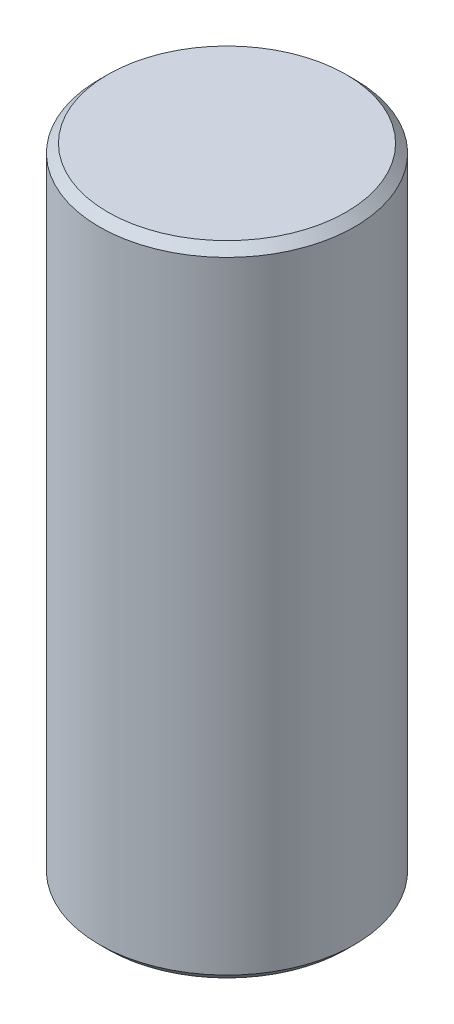
ISO-10303-21;
HEADER;
FILE_DESCRIPTION(('STEP AP214'),'2;1');
FILE_NAME('part.step','',(''),(''),'','','');
FILE_SCHEMA(('AUTOMOTIVE_DESIGN { 1 0 10303 214 1 1 1 1 }'));
ENDSEC;
DATA;
#1=APPLICATION_CONTEXT('core data for automotive mechanical design processes');
#2=APPLICATION_PROTOCOL_DEFINITION('international standard','automotive_design',2000,#1);
#3=PRODUCT_CONTEXT('',#1,'mechanical');
#4=PRODUCT('Part','Part','',(#3));
#5=PRODUCT_RELATED_PRODUCT_CATEGORY('part','',(#4));
#6=PRODUCT_DEFINITION_FORMATION('','',#4);
#7=PRODUCT_DEFINITION_CONTEXT('part definition',#1,'design');
#8=PRODUCT_DEFINITION('design','',#6,#7);
#9=PRODUCT_DEFINITION_SHAPE('','',#8);
#10=(LENGTH_UNIT() NAMED_UNIT(*) SI_UNIT(.MILLI.,.METRE.));
#11=(NAMED_UNIT(*) PLANE_ANGLE_UNIT() SI_UNIT($,.RADIAN.));
#12=(NAMED_UNIT(*) SI_UNIT($,.STERADIAN.) SOLID_ANGLE_UNIT());
#13=UNCERTAINTY_MEASURE_WITH_UNIT(LENGTH_MEASURE(1.E-05),#10,'distance_accuracy_value','');
#14=(GEOMETRIC_REPRESENTATION_CONTEXT(3) GLOBAL_UNCERTAINTY_ASSIGNED_CONTEXT((#13)) GLOBAL_UNIT_ASSIGNED_CONTEXT((#10,
#11,#12)) REPRESENTATION_CONTEXT('',''));
#15=CARTESIAN_POINT('',(0.,0.,0.));
#16=DIRECTION('',(0.,0.,1.));
#17=DIRECTION('',(1.,0.,0.));
#18=AXIS2_PLACEMENT_3D('',#15,#16,#17);
#19=CARTESIAN_POINT('',(0.,15.,0.));
#20=DIRECTION('',(0.,-1.,0.));
#21=DIRECTION('',(0.,0.,-1.));
#22=AXIS2_PLACEMENT_3D('',#19,#20,#21);
#23=CYLINDRICAL_SURFACE('',#22,3.);
#24=CARTESIAN_POINT('',(0.,0.199999999999999,0.));
#25=DIRECTION('',(0.,1.,0.));
#26=DIRECTION('',(0.,0.,1.));
#27=AXIS2_PLACEMENT_3D('',#24,#25,#26);
#28=CIRCLE('',#27,3.);
#29=CARTESIAN_POINT('',(0.,0.199999999999999,3.));
#30=VERTEX_POINT('',#29);
#31=EDGE_CURVE('E48',#30,#30,#28,.T.);
#32=ORIENTED_EDGE('',*,*,#31,.T.);
#33=EDGE_LOOP('',(#32));
#34=FACE_BOUND('',#33,.T.);
#35=CARTESIAN_POINT('',(0.,14.8,0.));
#36=DIRECTION('',(0.,1.,0.));
#37=DIRECTION('',(0.,0.,1.));
#38=AXIS2_PLACEMENT_3D('',#35,#36,#37);
#39=CIRCLE('',#38,3.);
#40=CARTESIAN_POINT('',(0.,14.8,3.));
#41=VERTEX_POINT('',#40);
#42=EDGE_CURVE('E52',#41,#41,#39,.F.);
#43=ORIENTED_EDGE('',*,*,#42,.T.);
#44=EDGE_LOOP('',(#43));
#45=FACE_BOUND('',#44,.T.);
#46=ADVANCED_FACE('F36',(#34,#45),#23,.T.);
#47=CARTESIAN_POINT('',(0.,15.,0.));
#48=DIRECTION('',(0.,1.,0.));
#49=DIRECTION('',(0.,0.,1.));
#50=AXIS2_PLACEMENT_3D('',#47,#48,#49);
#51=PLANE('',#50);
#52=CARTESIAN_POINT('',(0.,15.,0.));
#53=DIRECTION('',(0.,1.,0.));
#54=DIRECTION('',(0.,0.,1.));
#55=AXIS2_PLACEMENT_3D('',#52,#53,#54);
#56=CIRCLE('',#55,2.8);
#57=CARTESIAN_POINT('',(0.,15.,2.8));
#58=VERTEX_POINT('',#57);
#59=EDGE_CURVE('E10',#58,#58,#56,.T.);
#60=ORIENTED_EDGE('',*,*,#59,.T.);
#61=EDGE_LOOP('',(#60));
#62=FACE_BOUND('',#61,.T.);
#63=ADVANCED_FACE('F68',(#62),#51,.T.);
#64=CARTESIAN_POINT('',(0.,0.,0.));
#65=DIRECTION('',(0.,1.,0.));
#66=DIRECTION('',(0.,0.,1.));
#67=AXIS2_PLACEMENT_3D('',#64,#65,#66);
#68=PLANE('',#67);
#69=CARTESIAN_POINT('',(0.,0.,0.));
#70=DIRECTION('',(0.,1.,0.));
#71=DIRECTION('',(0.,0.,1.));
#72=AXIS2_PLACEMENT_3D('',#69,#70,#71);
#73=CIRCLE('',#72,2.8);
#74=CARTESIAN_POINT('',(0.,0.,2.8));
#75=VERTEX_POINT('',#74);
#76=EDGE_CURVE('E44',#75,#75,#73,.F.);
#77=ORIENTED_EDGE('',*,*,#76,.T.);
#78=EDGE_LOOP('',(#77));
#79=FACE_BOUND('',#78,.T.);
#80=ADVANCED_FACE('F65',(#79),#68,.F.);
#81=CARTESIAN_POINT('',(0.,0.199999999999999,0.));
#82=DIRECTION('',(0.,1.,0.));
#83=DIRECTION('',(0.,0.,1.));
#84=AXIS2_PLACEMENT_3D('',#81,#82,#83);
#85=CONICAL_SURFACE('',#84,3.,0.785398163397446);
#86=ORIENTED_EDGE('',*,*,#76,.F.);
#87=EDGE_LOOP('',(#86));
#88=FACE_BOUND('',#87,.T.);
#89=ORIENTED_EDGE('',*,*,#31,.F.);
#90=EDGE_LOOP('',(#89));
#91=FACE_BOUND('',#90,.T.);
#92=ADVANCED_FACE('F61',(#88,#91),#85,.T.);
#93=CARTESIAN_POINT('',(0.,15.,0.));
#94=DIRECTION('',(0.,-1.,0.));
#95=DIRECTION('',(0.,0.,-1.));
#96=AXIS2_PLACEMENT_3D('',#93,#94,#95);
#97=CONICAL_SURFACE('',#96,2.8,0.785398163397444);
#98=ORIENTED_EDGE('',*,*,#42,.F.);
#99=EDGE_LOOP('',(#98));
#100=FACE_BOUND('',#99,.T.);
#101=ORIENTED_EDGE('',*,*,#59,.F.);
#102=EDGE_LOOP('',(#101));
#103=FACE_BOUND('',#102,.T.);
#104=ADVANCED_FACE('F39',(#100,#103),#97,.T.);
#105=CLOSED_SHELL('',(#46,#63,#80,#92,#104));
#106=MANIFOLD_SOLID_BREP('B2',#105);
#107=ADVANCED_BREP_SHAPE_REPRESENTATION('',(#18,#106),#14);
#108=SHAPE_DEFINITION_REPRESENTATION(#9,#107);
ENDSEC;
END-ISO-10303-21;
